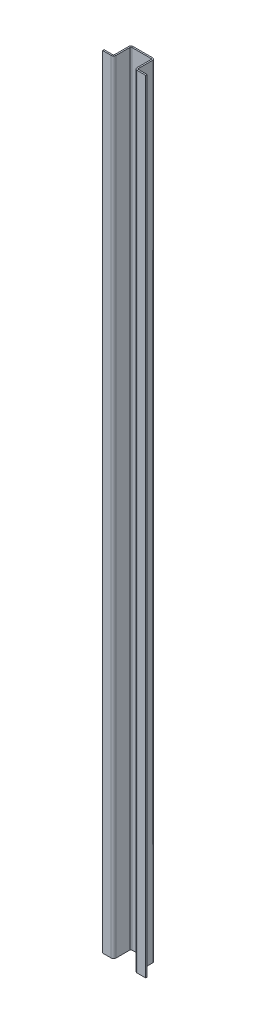
ISO-10303-21;
HEADER;
FILE_DESCRIPTION(('STEP AP214'),'2;1');
FILE_NAME('part.step','',(''),(''),'','','');
FILE_SCHEMA(('AUTOMOTIVE_DESIGN { 1 0 10303 214 1 1 1 1 }'));
ENDSEC;
DATA;
#1=APPLICATION_CONTEXT('core data for automotive mechanical design processes');
#2=APPLICATION_PROTOCOL_DEFINITION('international standard','automotive_design',2000,#1);
#3=PRODUCT_CONTEXT('',#1,'mechanical');
#4=PRODUCT('Part','Part','',(#3));
#5=PRODUCT_RELATED_PRODUCT_CATEGORY('part','',(#4));
#6=PRODUCT_DEFINITION_FORMATION('','',#4);
#7=PRODUCT_DEFINITION_CONTEXT('part definition',#1,'design');
#8=PRODUCT_DEFINITION('design','',#6,#7);
#9=PRODUCT_DEFINITION_SHAPE('','',#8);
#10=(LENGTH_UNIT() NAMED_UNIT(*) SI_UNIT(.MILLI.,.METRE.));
#11=(NAMED_UNIT(*) PLANE_ANGLE_UNIT() SI_UNIT($,.RADIAN.));
#12=(NAMED_UNIT(*) SI_UNIT($,.STERADIAN.) SOLID_ANGLE_UNIT());
#13=UNCERTAINTY_MEASURE_WITH_UNIT(LENGTH_MEASURE(1.E-05),#10,'distance_accuracy_value','');
#14=(GEOMETRIC_REPRESENTATION_CONTEXT(3) GLOBAL_UNCERTAINTY_ASSIGNED_CONTEXT((#13)) GLOBAL_UNIT_ASSIGNED_CONTEXT((#10,
#11,#12)) REPRESENTATION_CONTEXT('',''));
#15=CARTESIAN_POINT('',(0.,0.,0.));
#16=DIRECTION('',(0.,0.,1.));
#17=DIRECTION('',(1.,0.,0.));
#18=AXIS2_PLACEMENT_3D('',#15,#16,#17);
#19=CARTESIAN_POINT('',(312.,95.4999999999986,-1632.59932254293));
#20=DIRECTION('',(1.,0.,0.));
#21=DIRECTION('',(0.,0.,-1.));
#22=AXIS2_PLACEMENT_3D('',#19,#20,#21);
#23=PLANE('',#22);
#24=DIRECTION('',(0.,0.,1.));
#25=VECTOR('',#24,1.);
#26=CARTESIAN_POINT('',(312.,910.999999999999,-1632.59932254293));
#27=LINE('',#26,#25);
#28=CARTESIAN_POINT('',(312.,910.999999999999,-3.00000000000011));
#29=VERTEX_POINT('',#28);
#30=CARTESIAN_POINT('',(312.,910.999999999999,-1.50000000000017));
#31=VERTEX_POINT('',#30);
#32=EDGE_CURVE('E81',#29,#31,#27,.T.);
#33=ORIENTED_EDGE('',*,*,#32,.T.);
#34=DIRECTION('',(0.,1.,0.));
#35=VECTOR('',#34,1.);
#36=CARTESIAN_POINT('',(312.,95.4999999999986,-1.50000000000011));
#37=LINE('',#36,#35);
#38=CARTESIAN_POINT('',(312.,95.4999999999986,-1.50000000000011));
#39=VERTEX_POINT('',#38);
#40=EDGE_CURVE('E74',#39,#31,#37,.T.);
#41=ORIENTED_EDGE('',*,*,#40,.F.);
#42=DIRECTION('',(0.,0.,1.));
#43=VECTOR('',#42,1.);
#44=CARTESIAN_POINT('',(312.,95.4999999999986,-1632.59932254293));
#45=LINE('',#44,#43);
#46=CARTESIAN_POINT('',(312.,95.4999999999986,-3.));
#47=VERTEX_POINT('',#46);
#48=EDGE_CURVE('E332',#47,#39,#45,.T.);
#49=ORIENTED_EDGE('',*,*,#48,.F.);
#50=DIRECTION('',(0.,1.,0.));
#51=VECTOR('',#50,1.);
#52=CARTESIAN_POINT('',(312.,95.4999999999986,-3.00000000000011));
#53=LINE('',#52,#51);
#54=EDGE_CURVE('E344',#47,#29,#53,.T.);
#55=ORIENTED_EDGE('',*,*,#54,.T.);
#56=EDGE_LOOP('',(#33,#41,#49,#55));
#57=FACE_BOUND('',#56,.T.);
#58=ADVANCED_FACE('F42',(#57),#23,.T.);
#59=CARTESIAN_POINT('',(278.5,910.999999999999,-1632.59932254293));
#60=DIRECTION('',(0.,1.,0.));
#61=DIRECTION('',(0.,0.,1.));
#62=AXIS2_PLACEMENT_3D('',#59,#60,#61);
#63=PLANE('',#62);
#64=DIRECTION('',(0.,0.,1.));
#65=VECTOR('',#64,1.);
#66=CARTESIAN_POINT('',(303.,910.999999999999,-1632.59932254293));
#67=LINE('',#66,#65);
#68=CARTESIAN_POINT('',(303.,910.999999999999,-3.00000000000011));
#69=VERTEX_POINT('',#68);
#70=CARTESIAN_POINT('',(303.,910.999999999999,-1.50000000000011));
#71=VERTEX_POINT('',#70);
#72=EDGE_CURVE('E341',#69,#71,#67,.T.);
#73=ORIENTED_EDGE('',*,*,#72,.T.);
#74=DIRECTION('',(1.,0.,0.));
#75=VECTOR('',#74,1.);
#76=CARTESIAN_POINT('',(278.5,910.999999999999,-1.50000000000011));
#77=LINE('',#76,#75);
#78=EDGE_CURVE('E339',#71,#31,#77,.T.);
#79=ORIENTED_EDGE('',*,*,#78,.T.);
#80=ORIENTED_EDGE('',*,*,#32,.F.);
#81=DIRECTION('',(1.,0.,0.));
#82=VECTOR('',#81,1.);
#83=CARTESIAN_POINT('',(278.5,910.999999999999,-3.00000000000011));
#84=LINE('',#83,#82);
#85=EDGE_CURVE('E337',#29,#69,#84,.F.);
#86=ORIENTED_EDGE('',*,*,#85,.T.);
#87=EDGE_LOOP('',(#73,#79,#80,#86));
#88=FACE_BOUND('',#87,.T.);
#89=ADVANCED_FACE('F358',(#88),#63,.T.);
#90=CARTESIAN_POINT('',(302.,95.4999999999986,-1.50000000000011));
#91=DIRECTION('',(0.,0.,1.));
#92=DIRECTION('',(1.,0.,0.));
#93=AXIS2_PLACEMENT_3D('',#90,#91,#92);
#94=PLANE('',#93);
#95=ORIENTED_EDGE('',*,*,#40,.T.);
#96=ORIENTED_EDGE('',*,*,#78,.F.);
#97=DIRECTION('',(0.,1.,0.));
#98=VECTOR('',#97,1.);
#99=CARTESIAN_POINT('',(303.,95.4999999999986,-1.50000000000011));
#100=LINE('',#99,#98);
#101=CARTESIAN_POINT('',(303.,95.4999999999986,-1.50000000000011));
#102=VERTEX_POINT('',#101);
#103=EDGE_CURVE('E334',#71,#102,#100,.F.);
#104=ORIENTED_EDGE('',*,*,#103,.T.);
#105=DIRECTION('',(1.,0.,0.));
#106=VECTOR('',#105,1.);
#107=CARTESIAN_POINT('',(300.5,95.4999999999986,-1.50000000000011));
#108=LINE('',#107,#106);
#109=EDGE_CURVE('E52',#39,#102,#108,.F.);
#110=ORIENTED_EDGE('',*,*,#109,.F.);
#111=EDGE_LOOP('',(#95,#96,#104,#110));
#112=FACE_BOUND('',#111,.T.);
#113=ADVANCED_FACE('F356',(#112),#94,.T.);
#114=CARTESIAN_POINT('',(300.5,95.4999999999986,-1632.59932254293));
#115=DIRECTION('',(0.,-1.,0.));
#116=DIRECTION('',(0.,0.,-1.));
#117=AXIS2_PLACEMENT_3D('',#114,#115,#116);
#118=PLANE('',#117);
#119=ORIENTED_EDGE('',*,*,#48,.T.);
#120=ORIENTED_EDGE('',*,*,#109,.T.);
#121=DIRECTION('',(0.,0.,1.));
#122=VECTOR('',#121,1.);
#123=CARTESIAN_POINT('',(303.,95.4999999999986,-1632.59932254293));
#124=LINE('',#123,#122);
#125=CARTESIAN_POINT('',(303.,95.4999999999986,-3.00000000000011));
#126=VERTEX_POINT('',#125);
#127=EDGE_CURVE('E253',#126,#102,#124,.T.);
#128=ORIENTED_EDGE('',*,*,#127,.F.);
#129=DIRECTION('',(1.,0.,0.));
#130=VECTOR('',#129,1.);
#131=CARTESIAN_POINT('',(300.5,95.4999999999986,-3.00000000000011));
#132=LINE('',#131,#130);
#133=EDGE_CURVE('E11',#126,#47,#132,.T.);
#134=ORIENTED_EDGE('',*,*,#133,.T.);
#135=EDGE_LOOP('',(#119,#120,#128,#134));
#136=FACE_BOUND('',#135,.T.);
#137=ADVANCED_FACE('F355',(#136),#118,.T.);
#138=CARTESIAN_POINT('',(302.,95.4999999999986,-3.00000000000011));
#139=DIRECTION('',(0.,0.,1.));
#140=DIRECTION('',(1.,0.,0.));
#141=AXIS2_PLACEMENT_3D('',#138,#139,#140);
#142=PLANE('',#141);
#143=ORIENTED_EDGE('',*,*,#54,.F.);
#144=ORIENTED_EDGE('',*,*,#133,.F.);
#145=DIRECTION('',(0.,1.,0.));
#146=VECTOR('',#145,1.);
#147=CARTESIAN_POINT('',(303.,95.4999999999986,-3.00000000000011));
#148=LINE('',#147,#146);
#149=EDGE_CURVE('E46',#69,#126,#148,.F.);
#150=ORIENTED_EDGE('',*,*,#149,.F.);
#151=ORIENTED_EDGE('',*,*,#85,.F.);
#152=EDGE_LOOP('',(#143,#144,#150,#151));
#153=FACE_BOUND('',#152,.T.);
#154=ADVANCED_FACE('F44',(#153),#142,.F.);
#155=CARTESIAN_POINT('',(267.,95.4999999999986,-1632.59932254293));
#156=DIRECTION('',(-1.,0.,0.));
#157=DIRECTION('',(0.,0.,1.));
#158=AXIS2_PLACEMENT_3D('',#155,#156,#157);
#159=PLANE('',#158);
#160=DIRECTION('',(0.,0.,1.));
#161=VECTOR('',#160,1.);
#162=CARTESIAN_POINT('',(267.,95.4999999999986,-1632.59932254293));
#163=LINE('',#162,#161);
#164=CARTESIAN_POINT('',(267.,95.4999999999986,-3.00000000000011));
#165=VERTEX_POINT('',#164);
#166=CARTESIAN_POINT('',(267.,95.4999999999986,-1.50000000000006));
#167=VERTEX_POINT('',#166);
#168=EDGE_CURVE('E320',#165,#167,#163,.T.);
#169=ORIENTED_EDGE('',*,*,#168,.T.);
#170=DIRECTION('',(0.,1.,0.));
#171=VECTOR('',#170,1.);
#172=CARTESIAN_POINT('',(267.,95.4999999999986,-1.50000000000006));
#173=LINE('',#172,#171);
#174=CARTESIAN_POINT('',(267.,910.999999999999,-1.50000000000006));
#175=VERTEX_POINT('',#174);
#176=EDGE_CURVE('E311',#175,#167,#173,.F.);
#177=ORIENTED_EDGE('',*,*,#176,.F.);
#178=DIRECTION('',(0.,0.,1.));
#179=VECTOR('',#178,1.);
#180=CARTESIAN_POINT('',(267.,910.999999999999,-1632.59932254293));
#181=LINE('',#180,#179);
#182=CARTESIAN_POINT('',(267.,910.999999999999,-3.00000000000011));
#183=VERTEX_POINT('',#182);
#184=EDGE_CURVE('E308',#183,#175,#181,.T.);
#185=ORIENTED_EDGE('',*,*,#184,.F.);
#186=DIRECTION('',(0.,1.,0.));
#187=VECTOR('',#186,1.);
#188=CARTESIAN_POINT('',(267.,95.4999999999986,-3.00000000000006));
#189=LINE('',#188,#187);
#190=EDGE_CURVE('E117',#183,#165,#189,.F.);
#191=ORIENTED_EDGE('',*,*,#190,.T.);
#192=EDGE_LOOP('',(#169,#177,#185,#191));
#193=FACE_BOUND('',#192,.T.);
#194=ADVANCED_FACE('F487',(#193),#159,.T.);
#195=CARTESIAN_POINT('',(300.5,95.4999999999986,-1632.59932254293));
#196=DIRECTION('',(0.,-1.,0.));
#197=DIRECTION('',(0.,0.,-1.));
#198=AXIS2_PLACEMENT_3D('',#195,#196,#197);
#199=PLANE('',#198);
#200=DIRECTION('',(0.,0.,1.));
#201=VECTOR('',#200,1.);
#202=CARTESIAN_POINT('',(276.,95.4999999999986,-1632.59932254293));
#203=LINE('',#202,#201);
#204=CARTESIAN_POINT('',(276.,95.4999999999986,-3.00000000000011));
#205=VERTEX_POINT('',#204);
#206=CARTESIAN_POINT('',(276.,95.4999999999986,-1.50000000000005));
#207=VERTEX_POINT('',#206);
#208=EDGE_CURVE('E317',#205,#207,#203,.T.);
#209=ORIENTED_EDGE('',*,*,#208,.T.);
#210=DIRECTION('',(1.,0.,0.));
#211=VECTOR('',#210,1.);
#212=CARTESIAN_POINT('',(300.5,95.4999999999986,-1.50000000000006));
#213=LINE('',#212,#211);
#214=EDGE_CURVE('E314',#207,#167,#213,.F.);
#215=ORIENTED_EDGE('',*,*,#214,.T.);
#216=ORIENTED_EDGE('',*,*,#168,.F.);
#217=DIRECTION('',(1.,0.,0.));
#218=VECTOR('',#217,1.);
#219=CARTESIAN_POINT('',(300.5,95.4999999999986,-3.00000000000006));
#220=LINE('',#219,#218);
#221=EDGE_CURVE('E111',#165,#205,#220,.T.);
#222=ORIENTED_EDGE('',*,*,#221,.T.);
#223=EDGE_LOOP('',(#209,#215,#216,#222));
#224=FACE_BOUND('',#223,.T.);
#225=ADVANCED_FACE('F488',(#224),#199,.T.);
#226=CARTESIAN_POINT('',(267.,95.4999999999986,-1.50000000000006));
#227=DIRECTION('',(0.,0.,1.));
#228=DIRECTION('',(1.,0.,0.));
#229=AXIS2_PLACEMENT_3D('',#226,#227,#228);
#230=PLANE('',#229);
#231=DIRECTION('',(0.,1.,0.));
#232=VECTOR('',#231,1.);
#233=CARTESIAN_POINT('',(276.,95.4999999999986,-1.50000000000006));
#234=LINE('',#233,#232);
#235=CARTESIAN_POINT('',(276.,910.999999999999,-1.50000000000006));
#236=VERTEX_POINT('',#235);
#237=EDGE_CURVE('E322',#236,#207,#234,.F.);
#238=ORIENTED_EDGE('',*,*,#237,.F.);
#239=DIRECTION('',(1.,0.,0.));
#240=VECTOR('',#239,1.);
#241=CARTESIAN_POINT('',(278.5,910.999999999999,-1.50000000000006));
#242=LINE('',#241,#240);
#243=EDGE_CURVE('E305',#175,#236,#242,.T.);
#244=ORIENTED_EDGE('',*,*,#243,.F.);
#245=ORIENTED_EDGE('',*,*,#176,.T.);
#246=ORIENTED_EDGE('',*,*,#214,.F.);
#247=EDGE_LOOP('',(#238,#244,#245,#246));
#248=FACE_BOUND('',#247,.T.);
#249=ADVANCED_FACE('F485',(#248),#230,.T.);
#250=CARTESIAN_POINT('',(278.5,910.999999999999,-1632.59932254293));
#251=DIRECTION('',(0.,1.,0.));
#252=DIRECTION('',(0.,0.,1.));
#253=AXIS2_PLACEMENT_3D('',#250,#251,#252);
#254=PLANE('',#253);
#255=ORIENTED_EDGE('',*,*,#184,.T.);
#256=ORIENTED_EDGE('',*,*,#243,.T.);
#257=DIRECTION('',(0.,0.,1.));
#258=VECTOR('',#257,1.);
#259=CARTESIAN_POINT('',(276.,910.999999999999,-1632.59932254293));
#260=LINE('',#259,#258);
#261=CARTESIAN_POINT('',(276.,910.999999999999,-3.00000000000006));
#262=VERTEX_POINT('',#261);
#263=EDGE_CURVE('E325',#262,#236,#260,.T.);
#264=ORIENTED_EDGE('',*,*,#263,.F.);
#265=DIRECTION('',(1.,0.,0.));
#266=VECTOR('',#265,1.);
#267=CARTESIAN_POINT('',(278.5,910.999999999999,-3.00000000000006));
#268=LINE('',#267,#266);
#269=EDGE_CURVE('E90',#262,#183,#268,.F.);
#270=ORIENTED_EDGE('',*,*,#269,.T.);
#271=EDGE_LOOP('',(#255,#256,#264,#270));
#272=FACE_BOUND('',#271,.T.);
#273=ADVANCED_FACE('F482',(#272),#254,.T.);
#274=CARTESIAN_POINT('',(267.,95.4999999999986,-3.00000000000006));
#275=DIRECTION('',(0.,0.,1.));
#276=DIRECTION('',(1.,0.,0.));
#277=AXIS2_PLACEMENT_3D('',#274,#275,#276);
#278=PLANE('',#277);
#279=DIRECTION('',(0.,1.,0.));
#280=VECTOR('',#279,1.);
#281=CARTESIAN_POINT('',(276.,95.4999999999986,-3.00000000000006));
#282=LINE('',#281,#280);
#283=EDGE_CURVE('E278',#205,#262,#282,.T.);
#284=ORIENTED_EDGE('',*,*,#283,.F.);
#285=ORIENTED_EDGE('',*,*,#221,.F.);
#286=ORIENTED_EDGE('',*,*,#190,.F.);
#287=ORIENTED_EDGE('',*,*,#269,.F.);
#288=EDGE_LOOP('',(#284,#285,#286,#287));
#289=FACE_BOUND('',#288,.T.);
#290=ADVANCED_FACE('F489',(#289),#278,.F.);
#291=CARTESIAN_POINT('',(1909.75779691623,910.999999999999,-18.5));
#292=DIRECTION('',(0.,1.,0.));
#293=DIRECTION('',(1.,0.,0.));
#294=AXIS2_PLACEMENT_3D('',#291,#292,#293);
#295=PLANE('',#294);
#296=DIRECTION('',(0.,0.,1.));
#297=VECTOR('',#296,1.);
#298=CARTESIAN_POINT('',(277.,910.999999999999,-18.5));
#299=LINE('',#298,#297);
#300=CARTESIAN_POINT('',(277.,910.999999999999,-18.5));
#301=VERTEX_POINT('',#300);
#302=CARTESIAN_POINT('',(277.,910.999999999999,-4.00000000000002));
#303=VERTEX_POINT('',#302);
#304=EDGE_CURVE('E291',#301,#303,#299,.T.);
#305=ORIENTED_EDGE('',*,*,#304,.T.);
#306=DIRECTION('',(-1.,0.,0.));
#307=VECTOR('',#306,1.);
#308=CARTESIAN_POINT('',(1909.75779691623,910.999999999999,-4.));
#309=LINE('',#308,#307);
#310=CARTESIAN_POINT('',(278.5,910.999999999999,-3.99999999999997));
#311=VERTEX_POINT('',#310);
#312=EDGE_CURVE('E294',#311,#303,#309,.T.);
#313=ORIENTED_EDGE('',*,*,#312,.F.);
#314=DIRECTION('',(0.,0.,1.));
#315=VECTOR('',#314,1.);
#316=CARTESIAN_POINT('',(278.5,910.999999999999,-18.5));
#317=LINE('',#316,#315);
#318=CARTESIAN_POINT('',(278.5,910.999999999999,-18.5));
#319=VERTEX_POINT('',#318);
#320=EDGE_CURVE('E289',#311,#319,#317,.F.);
#321=ORIENTED_EDGE('',*,*,#320,.T.);
#322=DIRECTION('',(-1.,0.,0.));
#323=VECTOR('',#322,1.);
#324=CARTESIAN_POINT('',(1909.75779691623,910.999999999999,-18.5));
#325=LINE('',#324,#323);
#326=EDGE_CURVE('E286',#319,#301,#325,.T.);
#327=ORIENTED_EDGE('',*,*,#326,.T.);
#328=EDGE_LOOP('',(#305,#313,#321,#327));
#329=FACE_BOUND('',#328,.T.);
#330=ADVANCED_FACE('F472',(#329),#295,.T.);
#331=CARTESIAN_POINT('',(277.,95.4999999999986,-3.));
#332=DIRECTION('',(1.,0.,0.));
#333=DIRECTION('',(0.,0.,-1.));
#334=AXIS2_PLACEMENT_3D('',#331,#332,#333);
#335=PLANE('',#334);
#336=DIRECTION('',(0.,1.,0.));
#337=VECTOR('',#336,1.);
#338=CARTESIAN_POINT('',(277.,95.4999999999986,-18.5));
#339=LINE('',#338,#337);
#340=CARTESIAN_POINT('',(277.,95.4999999999986,-18.5));
#341=VERTEX_POINT('',#340);
#342=EDGE_CURVE('E298',#341,#301,#339,.T.);
#343=ORIENTED_EDGE('',*,*,#342,.F.);
#344=DIRECTION('',(0.,0.,-1.));
#345=VECTOR('',#344,1.);
#346=CARTESIAN_POINT('',(277.,95.4999999999986,-18.5));
#347=LINE('',#346,#345);
#348=CARTESIAN_POINT('',(277.,95.4999999999986,-4.));
#349=VERTEX_POINT('',#348);
#350=EDGE_CURVE('E284',#349,#341,#347,.T.);
#351=ORIENTED_EDGE('',*,*,#350,.F.);
#352=DIRECTION('',(0.,1.,0.));
#353=VECTOR('',#352,1.);
#354=CARTESIAN_POINT('',(277.,95.4999999999986,-4.));
#355=LINE('',#354,#353);
#356=EDGE_CURVE('E296',#303,#349,#355,.F.);
#357=ORIENTED_EDGE('',*,*,#356,.F.);
#358=ORIENTED_EDGE('',*,*,#304,.F.);
#359=EDGE_LOOP('',(#343,#351,#357,#358));
#360=FACE_BOUND('',#359,.T.);
#361=ADVANCED_FACE('F469',(#360),#335,.F.);
#362=CARTESIAN_POINT('',(1909.75779691623,95.4999999999986,-18.5));
#363=DIRECTION('',(0.,-1.,0.));
#364=DIRECTION('',(-1.,0.,0.));
#365=AXIS2_PLACEMENT_3D('',#362,#363,#364);
#366=PLANE('',#365);
#367=ORIENTED_EDGE('',*,*,#350,.T.);
#368=DIRECTION('',(-1.,0.,0.));
#369=VECTOR('',#368,1.);
#370=CARTESIAN_POINT('',(1909.75779691623,95.4999999999986,-18.5));
#371=LINE('',#370,#369);
#372=CARTESIAN_POINT('',(278.5,95.4999999999986,-18.5));
#373=VERTEX_POINT('',#372);
#374=EDGE_CURVE('E301',#373,#341,#371,.T.);
#375=ORIENTED_EDGE('',*,*,#374,.F.);
#376=DIRECTION('',(0.,0.,-1.));
#377=VECTOR('',#376,1.);
#378=CARTESIAN_POINT('',(278.5,95.4999999999986,-18.5));
#379=LINE('',#378,#377);
#380=CARTESIAN_POINT('',(278.5,95.4999999999986,-3.99999999999997));
#381=VERTEX_POINT('',#380);
#382=EDGE_CURVE('E138',#373,#381,#379,.F.);
#383=ORIENTED_EDGE('',*,*,#382,.T.);
#384=DIRECTION('',(-1.,0.,0.));
#385=VECTOR('',#384,1.);
#386=CARTESIAN_POINT('',(1909.75779691623,95.4999999999986,-4.));
#387=LINE('',#386,#385);
#388=EDGE_CURVE('E280',#381,#349,#387,.T.);
#389=ORIENTED_EDGE('',*,*,#388,.T.);
#390=EDGE_LOOP('',(#367,#375,#383,#389));
#391=FACE_BOUND('',#390,.T.);
#392=ADVANCED_FACE('F465',(#391),#366,.T.);
#393=CARTESIAN_POINT('',(278.5,95.4999999999986,-3.));
#394=DIRECTION('',(1.,0.,0.));
#395=DIRECTION('',(0.,0.,-1.));
#396=AXIS2_PLACEMENT_3D('',#393,#394,#395);
#397=PLANE('',#396);
#398=DIRECTION('',(0.,1.,0.));
#399=VECTOR('',#398,1.);
#400=CARTESIAN_POINT('',(278.5,95.4999999999986,-18.5));
#401=LINE('',#400,#399);
#402=EDGE_CURVE('E143',#373,#319,#401,.T.);
#403=ORIENTED_EDGE('',*,*,#402,.T.);
#404=ORIENTED_EDGE('',*,*,#320,.F.);
#405=DIRECTION('',(0.,1.,0.));
#406=VECTOR('',#405,1.);
#407=CARTESIAN_POINT('',(278.5,95.4999999999986,-4.));
#408=LINE('',#407,#406);
#409=EDGE_CURVE('E276',#311,#381,#408,.F.);
#410=ORIENTED_EDGE('',*,*,#409,.T.);
#411=ORIENTED_EDGE('',*,*,#382,.F.);
#412=EDGE_LOOP('',(#403,#404,#410,#411));
#413=FACE_BOUND('',#412,.T.);
#414=ADVANCED_FACE('F473',(#413),#397,.T.);
#415=CARTESIAN_POINT('',(-1330.75779691623,95.4999999999986,-18.5000000000001));
#416=DIRECTION('',(0.,-1.,0.));
#417=DIRECTION('',(1.,0.,0.));
#418=AXIS2_PLACEMENT_3D('',#415,#416,#417);
#419=PLANE('',#418);
#420=DIRECTION('',(0.,0.,-1.));
#421=VECTOR('',#420,1.);
#422=CARTESIAN_POINT('',(302.,95.4999999999986,-18.5000000000001));
#423=LINE('',#422,#421);
#424=CARTESIAN_POINT('',(302.,95.4999999999986,-18.5000000000001));
#425=VERTEX_POINT('',#424);
#426=CARTESIAN_POINT('',(302.,95.4999999999986,-4.00000000000011));
#427=VERTEX_POINT('',#426);
#428=EDGE_CURVE('E262',#425,#427,#423,.F.);
#429=ORIENTED_EDGE('',*,*,#428,.T.);
#430=DIRECTION('',(1.,0.,0.));
#431=VECTOR('',#430,1.);
#432=CARTESIAN_POINT('',(-1330.75779691623,95.4999999999986,-4.00000000000011));
#433=LINE('',#432,#431);
#434=CARTESIAN_POINT('',(300.5,95.4999999999986,-4.00000000000011));
#435=VERTEX_POINT('',#434);
#436=EDGE_CURVE('E251',#435,#427,#433,.T.);
#437=ORIENTED_EDGE('',*,*,#436,.F.);
#438=DIRECTION('',(0.,0.,-1.));
#439=VECTOR('',#438,1.);
#440=CARTESIAN_POINT('',(300.5,95.4999999999986,-18.5000000000001));
#441=LINE('',#440,#439);
#442=CARTESIAN_POINT('',(300.5,95.4999999999986,-18.5000000000001));
#443=VERTEX_POINT('',#442);
#444=EDGE_CURVE('E256',#435,#443,#441,.T.);
#445=ORIENTED_EDGE('',*,*,#444,.T.);
#446=DIRECTION('',(1.,0.,0.));
#447=VECTOR('',#446,1.);
#448=CARTESIAN_POINT('',(-1330.75779691623,95.4999999999986,-18.5000000000001));
#449=LINE('',#448,#447);
#450=EDGE_CURVE('E261',#443,#425,#449,.T.);
#451=ORIENTED_EDGE('',*,*,#450,.T.);
#452=EDGE_LOOP('',(#429,#437,#445,#451));
#453=FACE_BOUND('',#452,.T.);
#454=ADVANCED_FACE('F265',(#453),#419,.T.);
#455=CARTESIAN_POINT('',(302.,95.4999999999986,-21.0000000000001));
#456=DIRECTION('',(-1.,0.,0.));
#457=DIRECTION('',(0.,0.,1.));
#458=AXIS2_PLACEMENT_3D('',#455,#456,#457);
#459=PLANE('',#458);
#460=DIRECTION('',(0.,1.,0.));
#461=VECTOR('',#460,1.);
#462=CARTESIAN_POINT('',(302.,95.4999999999986,-4.00000000000011));
#463=LINE('',#462,#461);
#464=CARTESIAN_POINT('',(302.,910.999999999999,-4.00000000000011));
#465=VERTEX_POINT('',#464);
#466=EDGE_CURVE('E245',#427,#465,#463,.T.);
#467=ORIENTED_EDGE('',*,*,#466,.F.);
#468=ORIENTED_EDGE('',*,*,#428,.F.);
#469=DIRECTION('',(0.,1.,0.));
#470=VECTOR('',#469,1.);
#471=CARTESIAN_POINT('',(302.,95.4999999999986,-18.5000000000001));
#472=LINE('',#471,#470);
#473=CARTESIAN_POINT('',(302.,910.999999999999,-18.5000000000001));
#474=VERTEX_POINT('',#473);
#475=EDGE_CURVE('E246',#474,#425,#472,.F.);
#476=ORIENTED_EDGE('',*,*,#475,.F.);
#477=DIRECTION('',(0.,0.,1.));
#478=VECTOR('',#477,1.);
#479=CARTESIAN_POINT('',(302.,910.999999999999,-18.5000000000001));
#480=LINE('',#479,#478);
#481=EDGE_CURVE('E426',#465,#474,#480,.F.);
#482=ORIENTED_EDGE('',*,*,#481,.F.);
#483=EDGE_LOOP('',(#467,#468,#476,#482));
#484=FACE_BOUND('',#483,.T.);
#485=ADVANCED_FACE('F549',(#484),#459,.F.);
#486=CARTESIAN_POINT('',(-1330.75779691623,910.999999999999,-18.5000000000001));
#487=DIRECTION('',(0.,1.,0.));
#488=DIRECTION('',(-1.,0.,0.));
#489=AXIS2_PLACEMENT_3D('',#486,#487,#488);
#490=PLANE('',#489);
#491=ORIENTED_EDGE('',*,*,#481,.T.);
#492=DIRECTION('',(1.,0.,0.));
#493=VECTOR('',#492,1.);
#494=CARTESIAN_POINT('',(-1330.75779691623,910.999999999999,-18.5000000000001));
#495=LINE('',#494,#493);
#496=CARTESIAN_POINT('',(300.5,910.999999999999,-18.5000000000001));
#497=VERTEX_POINT('',#496);
#498=EDGE_CURVE('E272',#497,#474,#495,.T.);
#499=ORIENTED_EDGE('',*,*,#498,.F.);
#500=DIRECTION('',(0.,0.,1.));
#501=VECTOR('',#500,1.);
#502=CARTESIAN_POINT('',(300.5,910.999999999999,-18.5000000000001));
#503=LINE('',#502,#501);
#504=CARTESIAN_POINT('',(300.5,910.999999999999,-4.00000000000011));
#505=VERTEX_POINT('',#504);
#506=EDGE_CURVE('E165',#497,#505,#503,.T.);
#507=ORIENTED_EDGE('',*,*,#506,.T.);
#508=DIRECTION('',(1.,0.,0.));
#509=VECTOR('',#508,1.);
#510=CARTESIAN_POINT('',(-1330.75779691623,910.999999999999,-4.00000000000011));
#511=LINE('',#510,#509);
#512=EDGE_CURVE('E361',#505,#465,#511,.T.);
#513=ORIENTED_EDGE('',*,*,#512,.T.);
#514=EDGE_LOOP('',(#491,#499,#507,#513));
#515=FACE_BOUND('',#514,.T.);
#516=ADVANCED_FACE('F554',(#515),#490,.T.);
#517=CARTESIAN_POINT('',(300.5,95.4999999999986,-21.0000000000001));
#518=DIRECTION('',(-1.,0.,0.));
#519=DIRECTION('',(0.,0.,1.));
#520=AXIS2_PLACEMENT_3D('',#517,#518,#519);
#521=PLANE('',#520);
#522=DIRECTION('',(0.,1.,0.));
#523=VECTOR('',#522,1.);
#524=CARTESIAN_POINT('',(300.5,95.4999999999986,-4.00000000000011));
#525=LINE('',#524,#523);
#526=EDGE_CURVE('E238',#505,#435,#525,.F.);
#527=ORIENTED_EDGE('',*,*,#526,.F.);
#528=ORIENTED_EDGE('',*,*,#506,.F.);
#529=DIRECTION('',(0.,1.,0.));
#530=VECTOR('',#529,1.);
#531=CARTESIAN_POINT('',(300.5,95.4999999999986,-18.5000000000001));
#532=LINE('',#531,#530);
#533=EDGE_CURVE('E169',#497,#443,#532,.F.);
#534=ORIENTED_EDGE('',*,*,#533,.T.);
#535=ORIENTED_EDGE('',*,*,#444,.F.);
#536=EDGE_LOOP('',(#527,#528,#534,#535));
#537=FACE_BOUND('',#536,.T.);
#538=ADVANCED_FACE('F257',(#537),#521,.T.);
#539=CARTESIAN_POINT('',(277.,95.4999999999986,-21.));
#540=DIRECTION('',(0.,0.,1.));
#541=DIRECTION('',(1.,0.,0.));
#542=AXIS2_PLACEMENT_3D('',#539,#540,#541);
#543=PLANE('',#542);
#544=DIRECTION('',(0.,1.,0.));
#545=VECTOR('',#544,1.);
#546=CARTESIAN_POINT('',(299.5,95.4999999999986,-21.));
#547=LINE('',#546,#545);
#548=CARTESIAN_POINT('',(299.5,95.4999999999986,-21.));
#549=VERTEX_POINT('',#548);
#550=CARTESIAN_POINT('',(299.5,910.999999999999,-21.));
#551=VERTEX_POINT('',#550);
#552=EDGE_CURVE('E177',#549,#551,#547,.T.);
#553=ORIENTED_EDGE('',*,*,#552,.F.);
#554=DIRECTION('',(1.,0.,0.));
#555=VECTOR('',#554,1.);
#556=CARTESIAN_POINT('',(300.5,95.4999999999986,-21.));
#557=LINE('',#556,#555);
#558=CARTESIAN_POINT('',(279.5,95.4999999999986,-21.));
#559=VERTEX_POINT('',#558);
#560=EDGE_CURVE('E395',#559,#549,#557,.T.);
#561=ORIENTED_EDGE('',*,*,#560,.F.);
#562=DIRECTION('',(0.,1.,0.));
#563=VECTOR('',#562,1.);
#564=CARTESIAN_POINT('',(279.5,95.4999999999986,-21.));
#565=LINE('',#564,#563);
#566=CARTESIAN_POINT('',(279.5,910.999999999999,-21.));
#567=VERTEX_POINT('',#566);
#568=EDGE_CURVE('E185',#567,#559,#565,.F.);
#569=ORIENTED_EDGE('',*,*,#568,.F.);
#570=DIRECTION('',(1.,0.,0.));
#571=VECTOR('',#570,1.);
#572=CARTESIAN_POINT('',(278.5,910.999999999999,-21.));
#573=LINE('',#572,#571);
#574=EDGE_CURVE('E399',#551,#567,#573,.F.);
#575=ORIENTED_EDGE('',*,*,#574,.F.);
#576=EDGE_LOOP('',(#553,#561,#569,#575));
#577=FACE_BOUND('',#576,.T.);
#578=ADVANCED_FACE('F461',(#577),#543,.F.);
#579=CARTESIAN_POINT('',(277.,910.999999999999,1611.99042289558));
#580=DIRECTION('',(0.,-1.,0.));
#581=DIRECTION('',(0.,0.,-1.));
#582=AXIS2_PLACEMENT_3D('',#579,#580,#581);
#583=PLANE('',#582);
#584=DIRECTION('',(0.,0.,-1.));
#585=VECTOR('',#584,1.);
#586=CARTESIAN_POINT('',(299.5,910.999999999999,1611.99042289558));
#587=LINE('',#586,#585);
#588=CARTESIAN_POINT('',(299.5,910.999999999999,-19.5));
#589=VERTEX_POINT('',#588);
#590=EDGE_CURVE('E275',#589,#551,#587,.T.);
#591=ORIENTED_EDGE('',*,*,#590,.T.);
#592=ORIENTED_EDGE('',*,*,#574,.T.);
#593=DIRECTION('',(0.,0.,-1.));
#594=VECTOR('',#593,1.);
#595=CARTESIAN_POINT('',(279.5,910.999999999999,1611.99042289558));
#596=LINE('',#595,#594);
#597=CARTESIAN_POINT('',(279.5,910.999999999999,-19.5));
#598=VERTEX_POINT('',#597);
#599=EDGE_CURVE('E419',#598,#567,#596,.T.);
#600=ORIENTED_EDGE('',*,*,#599,.F.);
#601=DIRECTION('',(1.,0.,0.));
#602=VECTOR('',#601,1.);
#603=CARTESIAN_POINT('',(277.,910.999999999999,-19.5));
#604=LINE('',#603,#602);
#605=EDGE_CURVE('E405',#589,#598,#604,.F.);
#606=ORIENTED_EDGE('',*,*,#605,.F.);
#607=EDGE_LOOP('',(#591,#592,#600,#606));
#608=FACE_BOUND('',#607,.T.);
#609=ADVANCED_FACE('F452',(#608),#583,.F.);
#610=CARTESIAN_POINT('',(277.,95.4999999999986,1611.99042289558));
#611=DIRECTION('',(0.,1.,0.));
#612=DIRECTION('',(0.,0.,1.));
#613=AXIS2_PLACEMENT_3D('',#610,#611,#612);
#614=PLANE('',#613);
#615=DIRECTION('',(0.,0.,-1.));
#616=VECTOR('',#615,1.);
#617=CARTESIAN_POINT('',(279.5,95.4999999999986,1611.99042289558));
#618=LINE('',#617,#616);
#619=CARTESIAN_POINT('',(279.5,95.4999999999986,-19.5));
#620=VERTEX_POINT('',#619);
#621=EDGE_CURVE('E416',#620,#559,#618,.T.);
#622=ORIENTED_EDGE('',*,*,#621,.T.);
#623=ORIENTED_EDGE('',*,*,#560,.T.);
#624=DIRECTION('',(0.,0.,-1.));
#625=VECTOR('',#624,1.);
#626=CARTESIAN_POINT('',(299.5,95.4999999999986,1611.99042289558));
#627=LINE('',#626,#625);
#628=CARTESIAN_POINT('',(299.5,95.4999999999986,-19.5));
#629=VERTEX_POINT('',#628);
#630=EDGE_CURVE('E414',#629,#549,#627,.T.);
#631=ORIENTED_EDGE('',*,*,#630,.F.);
#632=DIRECTION('',(1.,0.,0.));
#633=VECTOR('',#632,1.);
#634=CARTESIAN_POINT('',(277.,95.4999999999986,-19.5));
#635=LINE('',#634,#633);
#636=EDGE_CURVE('E411',#620,#629,#635,.T.);
#637=ORIENTED_EDGE('',*,*,#636,.F.);
#638=EDGE_LOOP('',(#622,#623,#631,#637));
#639=FACE_BOUND('',#638,.T.);
#640=ADVANCED_FACE('F440',(#639),#614,.F.);
#641=CARTESIAN_POINT('',(277.,95.4999999999986,-19.5));
#642=DIRECTION('',(0.,0.,1.));
#643=DIRECTION('',(1.,0.,0.));
#644=AXIS2_PLACEMENT_3D('',#641,#642,#643);
#645=PLANE('',#644);
#646=DIRECTION('',(0.,1.,0.));
#647=VECTOR('',#646,1.);
#648=CARTESIAN_POINT('',(299.5,95.4999999999986,-19.5));
#649=LINE('',#648,#647);
#650=EDGE_CURVE('E402',#629,#589,#649,.T.);
#651=ORIENTED_EDGE('',*,*,#650,.T.);
#652=ORIENTED_EDGE('',*,*,#605,.T.);
#653=DIRECTION('',(0.,1.,0.));
#654=VECTOR('',#653,1.);
#655=CARTESIAN_POINT('',(279.5,95.4999999999986,-19.5));
#656=LINE('',#655,#654);
#657=EDGE_CURVE('E408',#598,#620,#656,.F.);
#658=ORIENTED_EDGE('',*,*,#657,.T.);
#659=ORIENTED_EDGE('',*,*,#636,.T.);
#660=EDGE_LOOP('',(#651,#652,#658,#659));
#661=FACE_BOUND('',#660,.T.);
#662=ADVANCED_FACE('F443',(#661),#645,.T.);
#663=CARTESIAN_POINT('',(299.5,910.999999999999,-18.5));
#664=DIRECTION('',(0.,1.,0.));
#665=DIRECTION('',(0.,0.,1.));
#666=AXIS2_PLACEMENT_3D('',#663,#664,#665);
#667=PLANE('',#666);
#668=ORIENTED_EDGE('',*,*,#590,.F.);
#669=CARTESIAN_POINT('',(299.5,910.999999999999,-18.5));
#670=DIRECTION('',(0.,1.,0.));
#671=DIRECTION('',(0.,0.,1.));
#672=AXIS2_PLACEMENT_3D('',#669,#670,#671);
#673=CIRCLE('',#672,1.);
#674=EDGE_CURVE('E389',#589,#497,#673,.F.);
#675=ORIENTED_EDGE('',*,*,#674,.T.);
#676=ORIENTED_EDGE('',*,*,#498,.T.);
#677=CARTESIAN_POINT('',(299.5,910.999999999999,-18.5));
#678=DIRECTION('',(0.,1.,0.));
#679=DIRECTION('',(0.,0.,1.));
#680=AXIS2_PLACEMENT_3D('',#677,#678,#679);
#681=CIRCLE('',#680,2.5);
#682=EDGE_CURVE('E388',#551,#474,#681,.F.);
#683=ORIENTED_EDGE('',*,*,#682,.F.);
#684=EDGE_LOOP('',(#668,#675,#676,#683));
#685=FACE_BOUND('',#684,.T.);
#686=ADVANCED_FACE('F567',(#685),#667,.T.);
#687=CARTESIAN_POINT('',(299.5,95.4999999999986,-18.5));
#688=DIRECTION('',(0.,-1.,0.));
#689=DIRECTION('',(0.,0.,-1.));
#690=AXIS2_PLACEMENT_3D('',#687,#688,#689);
#691=PLANE('',#690);
#692=ORIENTED_EDGE('',*,*,#450,.F.);
#693=CARTESIAN_POINT('',(299.5,95.4999999999986,-18.5));
#694=DIRECTION('',(0.,1.,0.));
#695=DIRECTION('',(0.,0.,1.));
#696=AXIS2_PLACEMENT_3D('',#693,#694,#695);
#697=CIRCLE('',#696,1.);
#698=EDGE_CURVE('E382',#443,#629,#697,.T.);
#699=ORIENTED_EDGE('',*,*,#698,.T.);
#700=ORIENTED_EDGE('',*,*,#630,.T.);
#701=CARTESIAN_POINT('',(299.5,95.4999999999986,-18.5));
#702=DIRECTION('',(0.,1.,0.));
#703=DIRECTION('',(0.,0.,1.));
#704=AXIS2_PLACEMENT_3D('',#701,#702,#703);
#705=CIRCLE('',#704,2.5);
#706=EDGE_CURVE('E386',#425,#549,#705,.T.);
#707=ORIENTED_EDGE('',*,*,#706,.F.);
#708=EDGE_LOOP('',(#692,#699,#700,#707));
#709=FACE_BOUND('',#708,.T.);
#710=ADVANCED_FACE('F435',(#709),#691,.T.);
#711=CARTESIAN_POINT('',(299.5,-723.628500297727,-18.5));
#712=DIRECTION('',(0.,1.,0.));
#713=DIRECTION('',(0.,0.,1.));
#714=AXIS2_PLACEMENT_3D('',#711,#712,#713);
#715=CYLINDRICAL_SURFACE('',#714,2.5);
#716=ORIENTED_EDGE('',*,*,#706,.T.);
#717=ORIENTED_EDGE('',*,*,#552,.T.);
#718=ORIENTED_EDGE('',*,*,#682,.T.);
#719=ORIENTED_EDGE('',*,*,#475,.T.);
#720=EDGE_LOOP('',(#716,#717,#718,#719));
#721=FACE_BOUND('',#720,.T.);
#722=ADVANCED_FACE('F432',(#721),#715,.T.);
#723=CARTESIAN_POINT('',(299.5,-723.628500297727,-18.5));
#724=DIRECTION('',(0.,1.,0.));
#725=DIRECTION('',(0.,0.,1.));
#726=AXIS2_PLACEMENT_3D('',#723,#724,#725);
#727=CYLINDRICAL_SURFACE('',#726,1.);
#728=ORIENTED_EDGE('',*,*,#698,.F.);
#729=ORIENTED_EDGE('',*,*,#533,.F.);
#730=ORIENTED_EDGE('',*,*,#674,.F.);
#731=ORIENTED_EDGE('',*,*,#650,.F.);
#732=EDGE_LOOP('',(#728,#729,#730,#731));
#733=FACE_BOUND('',#732,.T.);
#734=ADVANCED_FACE('F566',(#733),#727,.F.);
#735=CARTESIAN_POINT('',(279.5,95.4999999999986,-18.5));
#736=DIRECTION('',(0.,-1.,0.));
#737=DIRECTION('',(0.,0.,-1.));
#738=AXIS2_PLACEMENT_3D('',#735,#736,#737);
#739=PLANE('',#738);
#740=ORIENTED_EDGE('',*,*,#621,.F.);
#741=CARTESIAN_POINT('',(279.5,95.4999999999986,-18.5));
#742=DIRECTION('',(0.,-1.,0.));
#743=DIRECTION('',(0.,0.,-1.));
#744=AXIS2_PLACEMENT_3D('',#741,#742,#743);
#745=CIRCLE('',#744,1.);
#746=EDGE_CURVE('E380',#620,#373,#745,.F.);
#747=ORIENTED_EDGE('',*,*,#746,.T.);
#748=ORIENTED_EDGE('',*,*,#374,.T.);
#749=CARTESIAN_POINT('',(279.5,95.4999999999986,-18.5));
#750=DIRECTION('',(0.,-1.,0.));
#751=DIRECTION('',(0.,0.,-1.));
#752=AXIS2_PLACEMENT_3D('',#749,#750,#751);
#753=CIRCLE('',#752,2.5);
#754=EDGE_CURVE('E379',#559,#341,#753,.F.);
#755=ORIENTED_EDGE('',*,*,#754,.F.);
#756=EDGE_LOOP('',(#740,#747,#748,#755));
#757=FACE_BOUND('',#756,.T.);
#758=ADVANCED_FACE('F463',(#757),#739,.T.);
#759=CARTESIAN_POINT('',(279.5,910.999999999999,-18.5));
#760=DIRECTION('',(0.,1.,0.));
#761=DIRECTION('',(0.,0.,1.));
#762=AXIS2_PLACEMENT_3D('',#759,#760,#761);
#763=PLANE('',#762);
#764=ORIENTED_EDGE('',*,*,#326,.F.);
#765=CARTESIAN_POINT('',(279.5,910.999999999999,-18.5));
#766=DIRECTION('',(0.,-1.,0.));
#767=DIRECTION('',(0.,0.,-1.));
#768=AXIS2_PLACEMENT_3D('',#765,#766,#767);
#769=CIRCLE('',#768,1.);
#770=EDGE_CURVE('E374',#319,#598,#769,.T.);
#771=ORIENTED_EDGE('',*,*,#770,.T.);
#772=ORIENTED_EDGE('',*,*,#599,.T.);
#773=CARTESIAN_POINT('',(279.5,910.999999999999,-18.5));
#774=DIRECTION('',(0.,-1.,0.));
#775=DIRECTION('',(0.,0.,-1.));
#776=AXIS2_PLACEMENT_3D('',#773,#774,#775);
#777=CIRCLE('',#776,2.5);
#778=EDGE_CURVE('E377',#301,#567,#777,.T.);
#779=ORIENTED_EDGE('',*,*,#778,.F.);
#780=EDGE_LOOP('',(#764,#771,#772,#779));
#781=FACE_BOUND('',#780,.T.);
#782=ADVANCED_FACE('F457',(#781),#763,.T.);
#783=CARTESIAN_POINT('',(279.5,1728.59005620176,-18.5));
#784=DIRECTION('',(0.,-1.,0.));
#785=DIRECTION('',(0.,0.,-1.));
#786=AXIS2_PLACEMENT_3D('',#783,#784,#785);
#787=CYLINDRICAL_SURFACE('',#786,2.5);
#788=ORIENTED_EDGE('',*,*,#778,.T.);
#789=ORIENTED_EDGE('',*,*,#568,.T.);
#790=ORIENTED_EDGE('',*,*,#754,.T.);
#791=ORIENTED_EDGE('',*,*,#342,.T.);
#792=EDGE_LOOP('',(#788,#789,#790,#791));
#793=FACE_BOUND('',#792,.T.);
#794=ADVANCED_FACE('F458',(#793),#787,.T.);
#795=CARTESIAN_POINT('',(279.5,1728.59005620176,-18.5));
#796=DIRECTION('',(0.,-1.,0.));
#797=DIRECTION('',(0.,0.,-1.));
#798=AXIS2_PLACEMENT_3D('',#795,#796,#797);
#799=CYLINDRICAL_SURFACE('',#798,1.);
#800=ORIENTED_EDGE('',*,*,#770,.F.);
#801=ORIENTED_EDGE('',*,*,#402,.F.);
#802=ORIENTED_EDGE('',*,*,#746,.F.);
#803=ORIENTED_EDGE('',*,*,#657,.F.);
#804=EDGE_LOOP('',(#800,#801,#802,#803));
#805=FACE_BOUND('',#804,.T.);
#806=ADVANCED_FACE('F450',(#805),#799,.F.);
#807=CARTESIAN_POINT('',(276.,910.999999999999,-4.00000000000006));
#808=DIRECTION('',(0.,-1.,0.));
#809=DIRECTION('',(0.,0.,-1.));
#810=AXIS2_PLACEMENT_3D('',#807,#808,#809);
#811=PLANE('',#810);
#812=ORIENTED_EDGE('',*,*,#312,.T.);
#813=CARTESIAN_POINT('',(276.,910.999999999999,-4.00000000000006));
#814=DIRECTION('',(0.,1.,0.));
#815=DIRECTION('',(0.,0.,1.));
#816=AXIS2_PLACEMENT_3D('',#813,#814,#815);
#817=CIRCLE('',#816,1.);
#818=EDGE_CURVE('E362',#262,#303,#817,.T.);
#819=ORIENTED_EDGE('',*,*,#818,.F.);
#820=ORIENTED_EDGE('',*,*,#263,.T.);
#821=CARTESIAN_POINT('',(276.,910.999999999999,-4.00000000000006));
#822=DIRECTION('',(0.,1.,0.));
#823=DIRECTION('',(0.,0.,1.));
#824=AXIS2_PLACEMENT_3D('',#821,#822,#823);
#825=CIRCLE('',#824,2.5);
#826=EDGE_CURVE('E369',#236,#311,#825,.T.);
#827=ORIENTED_EDGE('',*,*,#826,.T.);
#828=EDGE_LOOP('',(#812,#819,#820,#827));
#829=FACE_BOUND('',#828,.T.);
#830=ADVANCED_FACE('F479',(#829),#811,.F.);
#831=CARTESIAN_POINT('',(276.,95.4999999999986,-4.00000000000006));
#832=DIRECTION('',(0.,1.,0.));
#833=DIRECTION('',(0.,0.,1.));
#834=AXIS2_PLACEMENT_3D('',#831,#832,#833);
#835=PLANE('',#834);
#836=CARTESIAN_POINT('',(276.,95.4999999999986,-4.00000000000006));
#837=DIRECTION('',(0.,1.,0.));
#838=DIRECTION('',(0.,0.,1.));
#839=AXIS2_PLACEMENT_3D('',#836,#837,#838);
#840=CIRCLE('',#839,1.);
#841=EDGE_CURVE('E125',#349,#205,#840,.F.);
#842=ORIENTED_EDGE('',*,*,#841,.F.);
#843=ORIENTED_EDGE('',*,*,#388,.F.);
#844=CARTESIAN_POINT('',(276.,95.4999999999986,-4.00000000000006));
#845=DIRECTION('',(0.,1.,0.));
#846=DIRECTION('',(0.,0.,1.));
#847=AXIS2_PLACEMENT_3D('',#844,#845,#846);
#848=CIRCLE('',#847,2.5);
#849=EDGE_CURVE('E372',#381,#207,#848,.F.);
#850=ORIENTED_EDGE('',*,*,#849,.T.);
#851=ORIENTED_EDGE('',*,*,#208,.F.);
#852=EDGE_LOOP('',(#842,#843,#850,#851));
#853=FACE_BOUND('',#852,.T.);
#854=ADVANCED_FACE('F491',(#853),#835,.F.);
#855=CARTESIAN_POINT('',(276.,-720.88073225671,-4.00000000000006));
#856=DIRECTION('',(0.,1.,0.));
#857=DIRECTION('',(0.,0.,1.));
#858=AXIS2_PLACEMENT_3D('',#855,#856,#857);
#859=CYLINDRICAL_SURFACE('',#858,2.5);
#860=ORIENTED_EDGE('',*,*,#237,.T.);
#861=ORIENTED_EDGE('',*,*,#849,.F.);
#862=ORIENTED_EDGE('',*,*,#409,.F.);
#863=ORIENTED_EDGE('',*,*,#826,.F.);
#864=EDGE_LOOP('',(#860,#861,#862,#863));
#865=FACE_BOUND('',#864,.T.);
#866=ADVANCED_FACE('F477',(#865),#859,.T.);
#867=CARTESIAN_POINT('',(276.,-720.88073225671,-4.00000000000006));
#868=DIRECTION('',(0.,1.,0.));
#869=DIRECTION('',(0.,0.,1.));
#870=AXIS2_PLACEMENT_3D('',#867,#868,#869);
#871=CYLINDRICAL_SURFACE('',#870,1.);
#872=ORIENTED_EDGE('',*,*,#283,.T.);
#873=ORIENTED_EDGE('',*,*,#818,.T.);
#874=ORIENTED_EDGE('',*,*,#356,.T.);
#875=ORIENTED_EDGE('',*,*,#841,.T.);
#876=EDGE_LOOP('',(#872,#873,#874,#875));
#877=FACE_BOUND('',#876,.T.);
#878=ADVANCED_FACE('F492',(#877),#871,.F.);
#879=CARTESIAN_POINT('',(303.,95.4999999999986,-4.00000000000011));
#880=DIRECTION('',(0.,1.,0.));
#881=DIRECTION('',(0.,0.,1.));
#882=AXIS2_PLACEMENT_3D('',#879,#880,#881);
#883=PLANE('',#882);
#884=ORIENTED_EDGE('',*,*,#436,.T.);
#885=CARTESIAN_POINT('',(303.,95.4999999999986,-4.00000000000011));
#886=DIRECTION('',(0.,-1.,0.));
#887=DIRECTION('',(0.,0.,-1.));
#888=AXIS2_PLACEMENT_3D('',#885,#886,#887);
#889=CIRCLE('',#888,1.);
#890=EDGE_CURVE('E350',#126,#427,#889,.T.);
#891=ORIENTED_EDGE('',*,*,#890,.F.);
#892=ORIENTED_EDGE('',*,*,#127,.T.);
#893=CARTESIAN_POINT('',(303.,95.4999999999986,-4.00000000000011));
#894=DIRECTION('',(0.,-1.,0.));
#895=DIRECTION('',(0.,0.,-1.));
#896=AXIS2_PLACEMENT_3D('',#893,#894,#895);
#897=CIRCLE('',#896,2.5);
#898=EDGE_CURVE('E242',#102,#435,#897,.T.);
#899=ORIENTED_EDGE('',*,*,#898,.T.);
#900=EDGE_LOOP('',(#884,#891,#892,#899));
#901=FACE_BOUND('',#900,.T.);
#902=ADVANCED_FACE('F249',(#901),#883,.F.);
#903=CARTESIAN_POINT('',(303.,910.999999999999,-4.00000000000011));
#904=DIRECTION('',(0.,-1.,0.));
#905=DIRECTION('',(0.,0.,-1.));
#906=AXIS2_PLACEMENT_3D('',#903,#904,#905);
#907=PLANE('',#906);
#908=CARTESIAN_POINT('',(303.,910.999999999999,-4.00000000000011));
#909=DIRECTION('',(0.,-1.,0.));
#910=DIRECTION('',(0.,0.,-1.));
#911=AXIS2_PLACEMENT_3D('',#908,#909,#910);
#912=CIRCLE('',#911,1.);
#913=EDGE_CURVE('E152',#465,#69,#912,.F.);
#914=ORIENTED_EDGE('',*,*,#913,.F.);
#915=ORIENTED_EDGE('',*,*,#512,.F.);
#916=CARTESIAN_POINT('',(303.,910.999999999999,-4.00000000000011));
#917=DIRECTION('',(0.,-1.,0.));
#918=DIRECTION('',(0.,0.,-1.));
#919=AXIS2_PLACEMENT_3D('',#916,#917,#918);
#920=CIRCLE('',#919,2.5);
#921=EDGE_CURVE('E244',#505,#71,#920,.F.);
#922=ORIENTED_EDGE('',*,*,#921,.T.);
#923=ORIENTED_EDGE('',*,*,#72,.F.);
#924=EDGE_LOOP('',(#914,#915,#922,#923));
#925=FACE_BOUND('',#924,.T.);
#926=ADVANCED_FACE('F359',(#925),#907,.F.);
#927=CARTESIAN_POINT('',(303.,1727.74812518915,-4.00000000000011));
#928=DIRECTION('',(0.,-1.,0.));
#929=DIRECTION('',(0.,0.,-1.));
#930=AXIS2_PLACEMENT_3D('',#927,#928,#929);
#931=CYLINDRICAL_SURFACE('',#930,2.5);
#932=ORIENTED_EDGE('',*,*,#103,.F.);
#933=ORIENTED_EDGE('',*,*,#921,.F.);
#934=ORIENTED_EDGE('',*,*,#526,.T.);
#935=ORIENTED_EDGE('',*,*,#898,.F.);
#936=EDGE_LOOP('',(#932,#933,#934,#935));
#937=FACE_BOUND('',#936,.T.);
#938=ADVANCED_FACE('F241',(#937),#931,.T.);
#939=CARTESIAN_POINT('',(303.,1727.74812518915,-4.00000000000011));
#940=DIRECTION('',(0.,-1.,0.));
#941=DIRECTION('',(0.,0.,-1.));
#942=AXIS2_PLACEMENT_3D('',#939,#940,#941);
#943=CYLINDRICAL_SURFACE('',#942,1.);
#944=ORIENTED_EDGE('',*,*,#149,.T.);
#945=ORIENTED_EDGE('',*,*,#890,.T.);
#946=ORIENTED_EDGE('',*,*,#466,.T.);
#947=ORIENTED_EDGE('',*,*,#913,.T.);
#948=EDGE_LOOP('',(#944,#945,#946,#947));
#949=FACE_BOUND('',#948,.T.);
#950=ADVANCED_FACE('F349',(#949),#943,.F.);
#951=CLOSED_SHELL('',(#58,#89,#113,#137,#154,#194,#225,#249,#273,#290,#330,#361,#392,#414,#454,
#485,#516,#538,#578,#609,#640,#662,#686,#710,#722,#734,#758,#782,#794,#806,#830,#854,#866,#878,
#902,#926,#938,#950));
#952=MANIFOLD_SOLID_BREP('B2',#951);
#953=ADVANCED_BREP_SHAPE_REPRESENTATION('',(#18,#952),#14);
#954=SHAPE_DEFINITION_REPRESENTATION(#9,#953);
ENDSEC;
END-ISO-10303-21;
